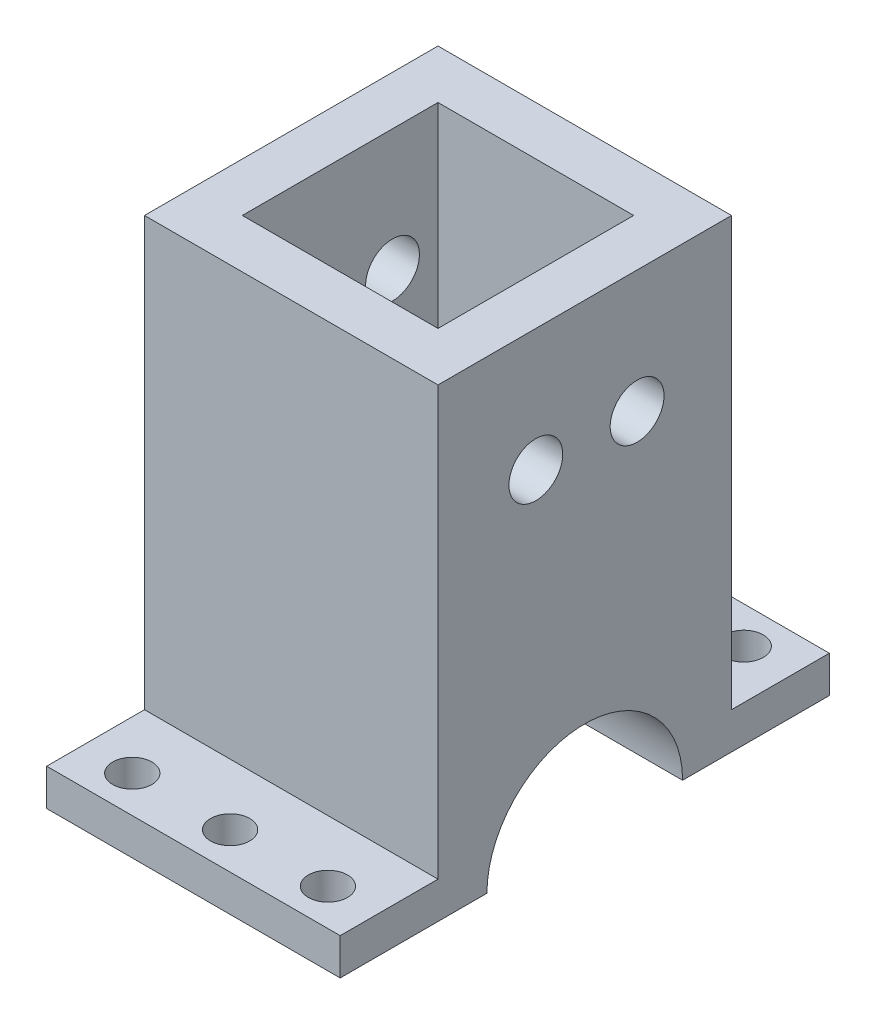
ISO-10303-21;
HEADER;
FILE_DESCRIPTION(('STEP AP214'),'2;1');
FILE_NAME('part.step','',(''),(''),'','','');
FILE_SCHEMA(('AUTOMOTIVE_DESIGN { 1 0 10303 214 1 1 1 1 }'));
ENDSEC;
DATA;
#1=APPLICATION_CONTEXT('core data for automotive mechanical design processes');
#2=APPLICATION_PROTOCOL_DEFINITION('international standard','automotive_design',2000,#1);
#3=PRODUCT_CONTEXT('',#1,'mechanical');
#4=PRODUCT('Part','Part','',(#3));
#5=PRODUCT_RELATED_PRODUCT_CATEGORY('part','',(#4));
#6=PRODUCT_DEFINITION_FORMATION('','',#4);
#7=PRODUCT_DEFINITION_CONTEXT('part definition',#1,'design');
#8=PRODUCT_DEFINITION('design','',#6,#7);
#9=PRODUCT_DEFINITION_SHAPE('','',#8);
#10=(LENGTH_UNIT() NAMED_UNIT(*) SI_UNIT(.MILLI.,.METRE.));
#11=(NAMED_UNIT(*) PLANE_ANGLE_UNIT() SI_UNIT($,.RADIAN.));
#12=(NAMED_UNIT(*) SI_UNIT($,.STERADIAN.) SOLID_ANGLE_UNIT());
#13=UNCERTAINTY_MEASURE_WITH_UNIT(LENGTH_MEASURE(1.E-05),#10,'distance_accuracy_value','');
#14=(GEOMETRIC_REPRESENTATION_CONTEXT(3) GLOBAL_UNCERTAINTY_ASSIGNED_CONTEXT((#13)) GLOBAL_UNIT_ASSIGNED_CONTEXT((#10,
#11,#12)) REPRESENTATION_CONTEXT('',''));
#15=CARTESIAN_POINT('',(0.,0.,0.));
#16=DIRECTION('',(0.,0.,1.));
#17=DIRECTION('',(1.,0.,0.));
#18=AXIS2_PLACEMENT_3D('',#15,#16,#17);
#19=CARTESIAN_POINT('',(-4.,-20.,0.));
#20=DIRECTION('',(-1.,0.,0.));
#21=DIRECTION('',(0.,0.,1.));
#22=AXIS2_PLACEMENT_3D('',#19,#20,#21);
#23=PLANE('',#22);
#24=CARTESIAN_POINT('',(-4.,-10.,-12.2801394976566));
#25=DIRECTION('',(-1.,0.,0.));
#26=DIRECTION('',(0.,0.,1.));
#27=AXIS2_PLACEMENT_3D('',#24,#25,#26);
#28=CIRCLE('',#27,2.2);
#29=CARTESIAN_POINT('',(-4.,-10.,-10.0801394976566));
#30=VERTEX_POINT('',#29);
#31=EDGE_CURVE('E349',#30,#30,#28,.T.);
#32=ORIENTED_EDGE('',*,*,#31,.F.);
#33=EDGE_LOOP('',(#32));
#34=FACE_BOUND('',#33,.T.);
#35=CARTESIAN_POINT('',(-4.,-10.,-4.));
#36=DIRECTION('',(-1.,0.,0.));
#37=DIRECTION('',(0.,0.,1.));
#38=AXIS2_PLACEMENT_3D('',#35,#36,#37);
#39=CIRCLE('',#38,2.2);
#40=CARTESIAN_POINT('',(-4.,-10.,-1.8));
#41=VERTEX_POINT('',#40);
#42=EDGE_CURVE('E335',#41,#41,#39,.T.);
#43=ORIENTED_EDGE('',*,*,#42,.F.);
#44=EDGE_LOOP('',(#43));
#45=FACE_BOUND('',#44,.T.);
#46=DIRECTION('',(0.,0.,1.));
#47=VECTOR('',#46,1.);
#48=CARTESIAN_POINT('',(-4.,0.,0.));
#49=LINE('',#48,#47);
#50=CARTESIAN_POINT('',(-4.,0.,-20.));
#51=VERTEX_POINT('',#50);
#52=CARTESIAN_POINT('',(-4.,0.,4.));
#53=VERTEX_POINT('',#52);
#54=EDGE_CURVE('E266',#51,#53,#49,.T.);
#55=ORIENTED_EDGE('',*,*,#54,.F.);
#56=DIRECTION('',(0.,1.,0.));
#57=VECTOR('',#56,1.);
#58=CARTESIAN_POINT('',(-4.,-20.,-20.));
#59=LINE('',#58,#57);
#60=CARTESIAN_POINT('',(-4.,-35.,-20.));
#61=VERTEX_POINT('',#60);
#62=EDGE_CURVE('E11',#61,#51,#59,.T.);
#63=ORIENTED_EDGE('',*,*,#62,.F.);
#64=DIRECTION('',(0.,0.,1.));
#65=VECTOR('',#64,1.);
#66=CARTESIAN_POINT('',(-4.,-35.,0.));
#67=LINE('',#66,#65);
#68=CARTESIAN_POINT('',(-4.,-35.,-28.));
#69=VERTEX_POINT('',#68);
#70=EDGE_CURVE('E193',#69,#61,#67,.T.);
#71=ORIENTED_EDGE('',*,*,#70,.F.);
#72=DIRECTION('',(0.,1.,0.));
#73=VECTOR('',#72,1.);
#74=CARTESIAN_POINT('',(-4.,0.,-28.));
#75=LINE('',#74,#73);
#76=CARTESIAN_POINT('',(-4.,-38.,-28.));
#77=VERTEX_POINT('',#76);
#78=EDGE_CURVE('E173',#77,#69,#75,.T.);
#79=ORIENTED_EDGE('',*,*,#78,.F.);
#80=DIRECTION('',(0.,0.,1.));
#81=VECTOR('',#80,1.);
#82=CARTESIAN_POINT('',(-4.,-38.,0.));
#83=LINE('',#82,#81);
#84=CARTESIAN_POINT('',(-4.,-38.,-16.));
#85=VERTEX_POINT('',#84);
#86=EDGE_CURVE('E169',#77,#85,#83,.T.);
#87=ORIENTED_EDGE('',*,*,#86,.T.);
#88=CARTESIAN_POINT('',(-4.,-38.,-8.));
#89=DIRECTION('',(-1.,0.,0.));
#90=DIRECTION('',(0.,0.,1.));
#91=AXIS2_PLACEMENT_3D('',#88,#89,#90);
#92=CIRCLE('',#91,8.);
#93=CARTESIAN_POINT('',(-4.,-38.,0.));
#94=VERTEX_POINT('',#93);
#95=EDGE_CURVE('E151',#94,#85,#92,.T.);
#96=ORIENTED_EDGE('',*,*,#95,.F.);
#97=DIRECTION('',(0.,0.,1.));
#98=VECTOR('',#97,1.);
#99=CARTESIAN_POINT('',(-4.,-38.,-1.31838984174237E-13));
#100=LINE('',#99,#98);
#101=CARTESIAN_POINT('',(-4.,-38.,12.));
#102=VERTEX_POINT('',#101);
#103=EDGE_CURVE('E163',#94,#102,#100,.T.);
#104=ORIENTED_EDGE('',*,*,#103,.T.);
#105=DIRECTION('',(0.,1.,0.));
#106=VECTOR('',#105,1.);
#107=CARTESIAN_POINT('',(-4.,0.,12.));
#108=LINE('',#107,#106);
#109=CARTESIAN_POINT('',(-4.,-35.,12.));
#110=VERTEX_POINT('',#109);
#111=EDGE_CURVE('E179',#102,#110,#108,.T.);
#112=ORIENTED_EDGE('',*,*,#111,.T.);
#113=DIRECTION('',(0.,0.,-1.));
#114=VECTOR('',#113,1.);
#115=CARTESIAN_POINT('',(-4.,-35.,0.));
#116=LINE('',#115,#114);
#117=CARTESIAN_POINT('',(-4.,-35.,4.));
#118=VERTEX_POINT('',#117);
#119=EDGE_CURVE('E164',#110,#118,#116,.T.);
#120=ORIENTED_EDGE('',*,*,#119,.T.);
#121=DIRECTION('',(0.,1.,0.));
#122=VECTOR('',#121,1.);
#123=CARTESIAN_POINT('',(-4.,-20.,4.));
#124=LINE('',#123,#122);
#125=EDGE_CURVE('E285',#118,#53,#124,.T.);
#126=ORIENTED_EDGE('',*,*,#125,.T.);
#127=EDGE_LOOP('',(#55,#63,#71,#79,#87,#96,#104,#112,#120,#126));
#128=FACE_BOUND('',#127,.T.);
#129=ADVANCED_FACE('F40',(#34,#45,#128),#23,.T.);
#130=CARTESIAN_POINT('',(0.,-20.,-20.));
#131=DIRECTION('',(0.,0.,1.));
#132=DIRECTION('',(1.,0.,0.));
#133=AXIS2_PLACEMENT_3D('',#130,#131,#132);
#134=PLANE('',#133);
#135=DIRECTION('',(1.,0.,0.));
#136=VECTOR('',#135,1.);
#137=CARTESIAN_POINT('',(0.,0.,-20.));
#138=LINE('',#137,#136);
#139=CARTESIAN_POINT('',(20.,0.,-20.));
#140=VERTEX_POINT('',#139);
#141=EDGE_CURVE('E242',#51,#140,#138,.T.);
#142=ORIENTED_EDGE('',*,*,#141,.T.);
#143=DIRECTION('',(0.,1.,0.));
#144=VECTOR('',#143,1.);
#145=CARTESIAN_POINT('',(20.,-20.,-20.));
#146=LINE('',#145,#144);
#147=CARTESIAN_POINT('',(20.,-35.,-20.));
#148=VERTEX_POINT('',#147);
#149=EDGE_CURVE('E51',#148,#140,#146,.T.);
#150=ORIENTED_EDGE('',*,*,#149,.F.);
#151=DIRECTION('',(-1.,0.,0.));
#152=VECTOR('',#151,1.);
#153=CARTESIAN_POINT('',(20.,-35.,-20.));
#154=LINE('',#153,#152);
#155=EDGE_CURVE('E202',#148,#61,#154,.T.);
#156=ORIENTED_EDGE('',*,*,#155,.T.);
#157=ORIENTED_EDGE('',*,*,#62,.T.);
#158=EDGE_LOOP('',(#142,#150,#156,#157));
#159=FACE_BOUND('',#158,.T.);
#160=ADVANCED_FACE('F404',(#159),#134,.F.);
#161=CARTESIAN_POINT('',(20.,-20.,0.));
#162=DIRECTION('',(1.,0.,0.));
#163=DIRECTION('',(0.,0.,-1.));
#164=AXIS2_PLACEMENT_3D('',#161,#162,#163);
#165=PLANE('',#164);
#166=CARTESIAN_POINT('',(20.,-10.,-12.2801394976566));
#167=DIRECTION('',(1.,0.,0.));
#168=DIRECTION('',(0.,0.,-1.));
#169=AXIS2_PLACEMENT_3D('',#166,#167,#168);
#170=CIRCLE('',#169,2.2);
#171=CARTESIAN_POINT('',(20.,-10.,-14.4801394976566));
#172=VERTEX_POINT('',#171);
#173=EDGE_CURVE('E345',#172,#172,#170,.T.);
#174=ORIENTED_EDGE('',*,*,#173,.F.);
#175=EDGE_LOOP('',(#174));
#176=FACE_BOUND('',#175,.T.);
#177=CARTESIAN_POINT('',(20.,-10.,-4.));
#178=DIRECTION('',(1.,0.,0.));
#179=DIRECTION('',(0.,0.,-1.));
#180=AXIS2_PLACEMENT_3D('',#177,#178,#179);
#181=CIRCLE('',#180,2.2);
#182=CARTESIAN_POINT('',(20.,-10.,-6.2));
#183=VERTEX_POINT('',#182);
#184=EDGE_CURVE('E329',#183,#183,#181,.T.);
#185=ORIENTED_EDGE('',*,*,#184,.F.);
#186=EDGE_LOOP('',(#185));
#187=FACE_BOUND('',#186,.T.);
#188=DIRECTION('',(0.,0.,-1.));
#189=VECTOR('',#188,1.);
#190=CARTESIAN_POINT('',(20.,0.,0.));
#191=LINE('',#190,#189);
#192=CARTESIAN_POINT('',(20.,0.,4.));
#193=VERTEX_POINT('',#192);
#194=EDGE_CURVE('E274',#193,#140,#191,.T.);
#195=ORIENTED_EDGE('',*,*,#194,.F.);
#196=DIRECTION('',(0.,1.,0.));
#197=VECTOR('',#196,1.);
#198=CARTESIAN_POINT('',(20.,-20.,4.));
#199=LINE('',#198,#197);
#200=CARTESIAN_POINT('',(20.,-35.,4.));
#201=VERTEX_POINT('',#200);
#202=EDGE_CURVE('E282',#201,#193,#199,.T.);
#203=ORIENTED_EDGE('',*,*,#202,.F.);
#204=DIRECTION('',(0.,0.,-1.));
#205=VECTOR('',#204,1.);
#206=CARTESIAN_POINT('',(20.,-35.,0.));
#207=LINE('',#206,#205);
#208=CARTESIAN_POINT('',(20.,-35.,12.));
#209=VERTEX_POINT('',#208);
#210=EDGE_CURVE('E208',#209,#201,#207,.T.);
#211=ORIENTED_EDGE('',*,*,#210,.F.);
#212=DIRECTION('',(0.,1.,0.));
#213=VECTOR('',#212,1.);
#214=CARTESIAN_POINT('',(20.,0.,12.));
#215=LINE('',#214,#213);
#216=CARTESIAN_POINT('',(20.,-38.,12.));
#217=VERTEX_POINT('',#216);
#218=EDGE_CURVE('E204',#217,#209,#215,.T.);
#219=ORIENTED_EDGE('',*,*,#218,.F.);
#220=DIRECTION('',(0.,0.,1.));
#221=VECTOR('',#220,1.);
#222=CARTESIAN_POINT('',(20.,-38.,-1.31838984174237E-13));
#223=LINE('',#222,#221);
#224=CARTESIAN_POINT('',(20.,-38.,0.));
#225=VERTEX_POINT('',#224);
#226=EDGE_CURVE('E215',#225,#217,#223,.T.);
#227=ORIENTED_EDGE('',*,*,#226,.F.);
#228=CARTESIAN_POINT('',(20.,-38.,-8.));
#229=DIRECTION('',(-1.,0.,0.));
#230=DIRECTION('',(0.,0.,1.));
#231=AXIS2_PLACEMENT_3D('',#228,#229,#230);
#232=CIRCLE('',#231,8.);
#233=CARTESIAN_POINT('',(20.,-38.,-16.));
#234=VERTEX_POINT('',#233);
#235=EDGE_CURVE('E212',#225,#234,#232,.T.);
#236=ORIENTED_EDGE('',*,*,#235,.T.);
#237=DIRECTION('',(0.,0.,1.));
#238=VECTOR('',#237,1.);
#239=CARTESIAN_POINT('',(20.,-38.,0.));
#240=LINE('',#239,#238);
#241=CARTESIAN_POINT('',(20.,-38.,-28.));
#242=VERTEX_POINT('',#241);
#243=EDGE_CURVE('E171',#242,#234,#240,.T.);
#244=ORIENTED_EDGE('',*,*,#243,.F.);
#245=DIRECTION('',(0.,1.,0.));
#246=VECTOR('',#245,1.);
#247=CARTESIAN_POINT('',(20.,0.,-28.));
#248=LINE('',#247,#246);
#249=CARTESIAN_POINT('',(20.,-35.,-28.));
#250=VERTEX_POINT('',#249);
#251=EDGE_CURVE('E186',#242,#250,#248,.T.);
#252=ORIENTED_EDGE('',*,*,#251,.T.);
#253=DIRECTION('',(0.,0.,1.));
#254=VECTOR('',#253,1.);
#255=CARTESIAN_POINT('',(20.,-35.,0.));
#256=LINE('',#255,#254);
#257=EDGE_CURVE('E180',#250,#148,#256,.T.);
#258=ORIENTED_EDGE('',*,*,#257,.T.);
#259=ORIENTED_EDGE('',*,*,#149,.T.);
#260=EDGE_LOOP('',(#195,#203,#211,#219,#227,#236,#244,#252,#258,#259));
#261=FACE_BOUND('',#260,.T.);
#262=ADVANCED_FACE('F386',(#176,#187,#261),#165,.T.);
#263=CARTESIAN_POINT('',(16.,-20.,0.));
#264=DIRECTION('',(1.,0.,0.));
#265=DIRECTION('',(0.,0.,-1.));
#266=AXIS2_PLACEMENT_3D('',#263,#264,#265);
#267=PLANE('',#266);
#268=CARTESIAN_POINT('',(16.,-10.,-12.2801394976566));
#269=DIRECTION('',(1.,0.,0.));
#270=DIRECTION('',(0.,0.,-1.));
#271=AXIS2_PLACEMENT_3D('',#268,#269,#270);
#272=CIRCLE('',#271,2.2);
#273=CARTESIAN_POINT('',(16.,-10.,-14.4801394976566));
#274=VERTEX_POINT('',#273);
#275=EDGE_CURVE('E341',#274,#274,#272,.T.);
#276=ORIENTED_EDGE('',*,*,#275,.T.);
#277=EDGE_LOOP('',(#276));
#278=FACE_BOUND('',#277,.T.);
#279=CARTESIAN_POINT('',(16.,-10.,-4.));
#280=DIRECTION('',(1.,0.,0.));
#281=DIRECTION('',(0.,0.,-1.));
#282=AXIS2_PLACEMENT_3D('',#279,#280,#281);
#283=CIRCLE('',#282,2.2);
#284=CARTESIAN_POINT('',(16.,-10.,-6.2));
#285=VERTEX_POINT('',#284);
#286=EDGE_CURVE('E324',#285,#285,#283,.T.);
#287=ORIENTED_EDGE('',*,*,#286,.T.);
#288=EDGE_LOOP('',(#287));
#289=FACE_BOUND('',#288,.T.);
#290=DIRECTION('',(0.,0.,-1.));
#291=VECTOR('',#290,1.);
#292=CARTESIAN_POINT('',(16.,0.,0.));
#293=LINE('',#292,#291);
#294=CARTESIAN_POINT('',(16.,0.,0.));
#295=VERTEX_POINT('',#294);
#296=CARTESIAN_POINT('',(16.,0.,-16.));
#297=VERTEX_POINT('',#296);
#298=EDGE_CURVE('E228',#295,#297,#293,.T.);
#299=ORIENTED_EDGE('',*,*,#298,.T.);
#300=DIRECTION('',(0.,1.,0.));
#301=VECTOR('',#300,1.);
#302=CARTESIAN_POINT('',(16.,-20.,-16.));
#303=LINE('',#302,#301);
#304=CARTESIAN_POINT('',(16.,-20.,-16.));
#305=VERTEX_POINT('',#304);
#306=EDGE_CURVE('E60',#305,#297,#303,.T.);
#307=ORIENTED_EDGE('',*,*,#306,.F.);
#308=DIRECTION('',(0.,0.,-1.));
#309=VECTOR('',#308,1.);
#310=CARTESIAN_POINT('',(16.,-20.,0.));
#311=LINE('',#310,#309);
#312=CARTESIAN_POINT('',(16.,-20.,0.));
#313=VERTEX_POINT('',#312);
#314=EDGE_CURVE('E237',#313,#305,#311,.T.);
#315=ORIENTED_EDGE('',*,*,#314,.F.);
#316=DIRECTION('',(0.,1.,0.));
#317=VECTOR('',#316,1.);
#318=CARTESIAN_POINT('',(16.,-20.,0.));
#319=LINE('',#318,#317);
#320=EDGE_CURVE('E252',#313,#295,#319,.T.);
#321=ORIENTED_EDGE('',*,*,#320,.T.);
#322=EDGE_LOOP('',(#299,#307,#315,#321));
#323=FACE_BOUND('',#322,.T.);
#324=ADVANCED_FACE('F42',(#278,#289,#323),#267,.F.);
#325=CARTESIAN_POINT('',(0.,-20.,-16.));
#326=DIRECTION('',(0.,0.,1.));
#327=DIRECTION('',(1.,0.,0.));
#328=AXIS2_PLACEMENT_3D('',#325,#326,#327);
#329=PLANE('',#328);
#330=DIRECTION('',(1.,0.,0.));
#331=VECTOR('',#330,1.);
#332=CARTESIAN_POINT('',(0.,0.,-16.));
#333=LINE('',#332,#331);
#334=CARTESIAN_POINT('',(0.,0.,-16.));
#335=VERTEX_POINT('',#334);
#336=EDGE_CURVE('E262',#335,#297,#333,.T.);
#337=ORIENTED_EDGE('',*,*,#336,.F.);
#338=DIRECTION('',(0.,1.,0.));
#339=VECTOR('',#338,1.);
#340=CARTESIAN_POINT('',(0.,-20.,-16.));
#341=LINE('',#340,#339);
#342=CARTESIAN_POINT('',(0.,-20.,-16.));
#343=VERTEX_POINT('',#342);
#344=EDGE_CURVE('E290',#343,#335,#341,.T.);
#345=ORIENTED_EDGE('',*,*,#344,.F.);
#346=DIRECTION('',(1.,0.,0.));
#347=VECTOR('',#346,1.);
#348=CARTESIAN_POINT('',(0.,-20.,-16.));
#349=LINE('',#348,#347);
#350=EDGE_CURVE('E249',#343,#305,#349,.T.);
#351=ORIENTED_EDGE('',*,*,#350,.T.);
#352=ORIENTED_EDGE('',*,*,#306,.T.);
#353=EDGE_LOOP('',(#337,#345,#351,#352));
#354=FACE_BOUND('',#353,.T.);
#355=ADVANCED_FACE('F436',(#354),#329,.T.);
#356=CARTESIAN_POINT('',(0.,-20.,0.));
#357=DIRECTION('',(1.,0.,0.));
#358=DIRECTION('',(0.,0.,-1.));
#359=AXIS2_PLACEMENT_3D('',#356,#357,#358);
#360=PLANE('',#359);
#361=CARTESIAN_POINT('',(0.,-10.,-12.2801394976566));
#362=DIRECTION('',(1.,0.,0.));
#363=DIRECTION('',(0.,0.,-1.));
#364=AXIS2_PLACEMENT_3D('',#361,#362,#363);
#365=CIRCLE('',#364,2.2);
#366=CARTESIAN_POINT('',(0.,-10.,-14.4801394976566));
#367=VERTEX_POINT('',#366);
#368=EDGE_CURVE('E44',#367,#367,#365,.T.);
#369=ORIENTED_EDGE('',*,*,#368,.F.);
#370=EDGE_LOOP('',(#369));
#371=FACE_BOUND('',#370,.T.);
#372=CARTESIAN_POINT('',(0.,-10.,-4.));
#373=DIRECTION('',(1.,0.,0.));
#374=DIRECTION('',(0.,0.,-1.));
#375=AXIS2_PLACEMENT_3D('',#372,#373,#374);
#376=CIRCLE('',#375,2.2);
#377=CARTESIAN_POINT('',(0.,-10.,-6.2));
#378=VERTEX_POINT('',#377);
#379=EDGE_CURVE('E321',#378,#378,#376,.T.);
#380=ORIENTED_EDGE('',*,*,#379,.F.);
#381=EDGE_LOOP('',(#380));
#382=FACE_BOUND('',#381,.T.);
#383=DIRECTION('',(0.,0.,-1.));
#384=VECTOR('',#383,1.);
#385=CARTESIAN_POINT('',(0.,0.,0.));
#386=LINE('',#385,#384);
#387=CARTESIAN_POINT('',(0.,0.,0.));
#388=VERTEX_POINT('',#387);
#389=EDGE_CURVE('E258',#388,#335,#386,.T.);
#390=ORIENTED_EDGE('',*,*,#389,.F.);
#391=DIRECTION('',(0.,1.,0.));
#392=VECTOR('',#391,1.);
#393=CARTESIAN_POINT('',(0.,-20.,0.));
#394=LINE('',#393,#392);
#395=CARTESIAN_POINT('',(0.,-20.,0.));
#396=VERTEX_POINT('',#395);
#397=EDGE_CURVE('E99',#396,#388,#394,.T.);
#398=ORIENTED_EDGE('',*,*,#397,.F.);
#399=DIRECTION('',(0.,0.,-1.));
#400=VECTOR('',#399,1.);
#401=CARTESIAN_POINT('',(0.,-20.,0.));
#402=LINE('',#401,#400);
#403=EDGE_CURVE('E246',#396,#343,#402,.T.);
#404=ORIENTED_EDGE('',*,*,#403,.T.);
#405=ORIENTED_EDGE('',*,*,#344,.T.);
#406=EDGE_LOOP('',(#390,#398,#404,#405));
#407=FACE_BOUND('',#406,.T.);
#408=ADVANCED_FACE('F439',(#371,#382,#407),#360,.T.);
#409=CARTESIAN_POINT('',(0.,-20.,0.));
#410=DIRECTION('',(0.,0.,1.));
#411=DIRECTION('',(1.,0.,0.));
#412=AXIS2_PLACEMENT_3D('',#409,#410,#411);
#413=PLANE('',#412);
#414=DIRECTION('',(1.,0.,0.));
#415=VECTOR('',#414,1.);
#416=CARTESIAN_POINT('',(0.,0.,0.));
#417=LINE('',#416,#415);
#418=EDGE_CURVE('E255',#388,#295,#417,.T.);
#419=ORIENTED_EDGE('',*,*,#418,.T.);
#420=ORIENTED_EDGE('',*,*,#320,.F.);
#421=DIRECTION('',(1.,0.,0.));
#422=VECTOR('',#421,1.);
#423=CARTESIAN_POINT('',(0.,-20.,0.));
#424=LINE('',#423,#422);
#425=EDGE_CURVE('E241',#396,#313,#424,.T.);
#426=ORIENTED_EDGE('',*,*,#425,.F.);
#427=ORIENTED_EDGE('',*,*,#397,.T.);
#428=EDGE_LOOP('',(#419,#420,#426,#427));
#429=FACE_BOUND('',#428,.T.);
#430=ADVANCED_FACE('F442',(#429),#413,.F.);
#431=CARTESIAN_POINT('',(0.,-20.,4.));
#432=DIRECTION('',(0.,0.,1.));
#433=DIRECTION('',(1.,0.,0.));
#434=AXIS2_PLACEMENT_3D('',#431,#432,#433);
#435=PLANE('',#434);
#436=DIRECTION('',(1.,0.,0.));
#437=VECTOR('',#436,1.);
#438=CARTESIAN_POINT('',(0.,0.,4.));
#439=LINE('',#438,#437);
#440=EDGE_CURVE('E270',#53,#193,#439,.T.);
#441=ORIENTED_EDGE('',*,*,#440,.F.);
#442=ORIENTED_EDGE('',*,*,#125,.F.);
#443=DIRECTION('',(-1.,0.,0.));
#444=VECTOR('',#443,1.);
#445=CARTESIAN_POINT('',(20.,-35.,4.));
#446=LINE('',#445,#444);
#447=EDGE_CURVE('E231',#201,#118,#446,.T.);
#448=ORIENTED_EDGE('',*,*,#447,.F.);
#449=ORIENTED_EDGE('',*,*,#202,.T.);
#450=EDGE_LOOP('',(#441,#442,#448,#449));
#451=FACE_BOUND('',#450,.T.);
#452=ADVANCED_FACE('F401',(#451),#435,.T.);
#453=CARTESIAN_POINT('',(0.,0.,0.));
#454=DIRECTION('',(0.,1.,0.));
#455=DIRECTION('',(0.,0.,1.));
#456=AXIS2_PLACEMENT_3D('',#453,#454,#455);
#457=PLANE('',#456);
#458=ORIENTED_EDGE('',*,*,#298,.F.);
#459=ORIENTED_EDGE('',*,*,#418,.F.);
#460=ORIENTED_EDGE('',*,*,#389,.T.);
#461=ORIENTED_EDGE('',*,*,#336,.T.);
#462=EDGE_LOOP('',(#458,#459,#460,#461));
#463=FACE_BOUND('',#462,.T.);
#464=ORIENTED_EDGE('',*,*,#54,.T.);
#465=ORIENTED_EDGE('',*,*,#440,.T.);
#466=ORIENTED_EDGE('',*,*,#194,.T.);
#467=ORIENTED_EDGE('',*,*,#141,.F.);
#468=EDGE_LOOP('',(#464,#465,#466,#467));
#469=FACE_BOUND('',#468,.T.);
#470=ADVANCED_FACE('F403',(#463,#469),#457,.T.);
#471=CARTESIAN_POINT('',(0.,-20.,0.));
#472=DIRECTION('',(0.,1.,0.));
#473=DIRECTION('',(0.,0.,1.));
#474=AXIS2_PLACEMENT_3D('',#471,#472,#473);
#475=PLANE('',#474);
#476=ORIENTED_EDGE('',*,*,#425,.T.);
#477=ORIENTED_EDGE('',*,*,#314,.T.);
#478=ORIENTED_EDGE('',*,*,#350,.F.);
#479=ORIENTED_EDGE('',*,*,#403,.F.);
#480=EDGE_LOOP('',(#476,#477,#478,#479));
#481=FACE_BOUND('',#480,.T.);
#482=ADVANCED_FACE('F458',(#481),#475,.T.);
#483=CARTESIAN_POINT('',(20.,0.,12.));
#484=DIRECTION('',(0.,0.,1.));
#485=DIRECTION('',(1.,0.,0.));
#486=AXIS2_PLACEMENT_3D('',#483,#484,#485);
#487=PLANE('',#486);
#488=ORIENTED_EDGE('',*,*,#111,.F.);
#489=DIRECTION('',(-1.,0.,0.));
#490=VECTOR('',#489,1.);
#491=CARTESIAN_POINT('',(20.,-38.,12.));
#492=LINE('',#491,#490);
#493=EDGE_CURVE('E225',#217,#102,#492,.T.);
#494=ORIENTED_EDGE('',*,*,#493,.F.);
#495=ORIENTED_EDGE('',*,*,#218,.T.);
#496=DIRECTION('',(-1.,0.,0.));
#497=VECTOR('',#496,1.);
#498=CARTESIAN_POINT('',(20.,-35.,12.));
#499=LINE('',#498,#497);
#500=EDGE_CURVE('E218',#209,#110,#499,.T.);
#501=ORIENTED_EDGE('',*,*,#500,.T.);
#502=EDGE_LOOP('',(#488,#494,#495,#501));
#503=FACE_BOUND('',#502,.T.);
#504=ADVANCED_FACE('F395',(#503),#487,.T.);
#505=CARTESIAN_POINT('',(20.,-38.,-1.31838984174237E-13));
#506=DIRECTION('',(0.,-1.,0.));
#507=DIRECTION('',(0.,0.,-1.));
#508=AXIS2_PLACEMENT_3D('',#505,#506,#507);
#509=PLANE('',#508);
#510=CARTESIAN_POINT('',(16.,-38.,9.00000000000006));
#511=DIRECTION('',(0.,-1.,0.));
#512=DIRECTION('',(0.,0.,-1.));
#513=AXIS2_PLACEMENT_3D('',#510,#511,#512);
#514=CIRCLE('',#513,1.6);
#515=CARTESIAN_POINT('',(16.,-38.,7.40000000000006));
#516=VERTEX_POINT('',#515);
#517=EDGE_CURVE('E358',#516,#516,#514,.T.);
#518=ORIENTED_EDGE('',*,*,#517,.F.);
#519=EDGE_LOOP('',(#518));
#520=FACE_BOUND('',#519,.T.);
#521=CARTESIAN_POINT('',(0.,-38.,9.00000000000006));
#522=DIRECTION('',(0.,-1.,0.));
#523=DIRECTION('',(0.,0.,1.));
#524=AXIS2_PLACEMENT_3D('',#521,#522,#523);
#525=CIRCLE('',#524,1.6);
#526=CARTESIAN_POINT('',(0.,-38.,10.6000000000001));
#527=VERTEX_POINT('',#526);
#528=EDGE_CURVE('E362',#527,#527,#525,.T.);
#529=ORIENTED_EDGE('',*,*,#528,.F.);
#530=EDGE_LOOP('',(#529));
#531=FACE_BOUND('',#530,.T.);
#532=CARTESIAN_POINT('',(8.,-38.,9.));
#533=DIRECTION('',(0.,-1.,0.));
#534=DIRECTION('',(0.,0.,-1.));
#535=AXIS2_PLACEMENT_3D('',#532,#533,#534);
#536=CIRCLE('',#535,1.6);
#537=CARTESIAN_POINT('',(8.,-38.,7.4));
#538=VERTEX_POINT('',#537);
#539=EDGE_CURVE('E303',#538,#538,#536,.T.);
#540=ORIENTED_EDGE('',*,*,#539,.F.);
#541=EDGE_LOOP('',(#540));
#542=FACE_BOUND('',#541,.T.);
#543=ORIENTED_EDGE('',*,*,#103,.F.);
#544=DIRECTION('',(-1.,0.,0.));
#545=VECTOR('',#544,1.);
#546=CARTESIAN_POINT('',(20.,-38.,0.));
#547=LINE('',#546,#545);
#548=EDGE_CURVE('E157',#225,#94,#547,.T.);
#549=ORIENTED_EDGE('',*,*,#548,.F.);
#550=ORIENTED_EDGE('',*,*,#226,.T.);
#551=ORIENTED_EDGE('',*,*,#493,.T.);
#552=EDGE_LOOP('',(#543,#549,#550,#551));
#553=FACE_BOUND('',#552,.T.);
#554=ADVANCED_FACE('F391',(#520,#531,#542,#553),#509,.T.);
#555=CARTESIAN_POINT('',(20.,-38.,-8.));
#556=DIRECTION('',(-1.,0.,0.));
#557=DIRECTION('',(0.,0.,1.));
#558=AXIS2_PLACEMENT_3D('',#555,#556,#557);
#559=CYLINDRICAL_SURFACE('',#558,8.);
#560=ORIENTED_EDGE('',*,*,#95,.T.);
#561=DIRECTION('',(-1.,0.,0.));
#562=VECTOR('',#561,1.);
#563=CARTESIAN_POINT('',(20.,-38.,-16.));
#564=LINE('',#563,#562);
#565=EDGE_CURVE('E155',#234,#85,#564,.T.);
#566=ORIENTED_EDGE('',*,*,#565,.F.);
#567=ORIENTED_EDGE('',*,*,#235,.F.);
#568=ORIENTED_EDGE('',*,*,#548,.T.);
#569=EDGE_LOOP('',(#560,#566,#567,#568));
#570=FACE_BOUND('',#569,.T.);
#571=ADVANCED_FACE('F153',(#570),#559,.F.);
#572=CARTESIAN_POINT('',(20.,-35.,0.));
#573=DIRECTION('',(0.,1.,0.));
#574=DIRECTION('',(0.,0.,1.));
#575=AXIS2_PLACEMENT_3D('',#572,#573,#574);
#576=PLANE('',#575);
#577=CARTESIAN_POINT('',(16.,-35.,9.00000000000007));
#578=DIRECTION('',(0.,1.,0.));
#579=DIRECTION('',(0.,0.,1.));
#580=AXIS2_PLACEMENT_3D('',#577,#578,#579);
#581=CIRCLE('',#580,1.6);
#582=CARTESIAN_POINT('',(16.,-35.,10.6000000000001));
#583=VERTEX_POINT('',#582);
#584=EDGE_CURVE('E200',#583,#583,#581,.T.);
#585=ORIENTED_EDGE('',*,*,#584,.F.);
#586=EDGE_LOOP('',(#585));
#587=FACE_BOUND('',#586,.T.);
#588=CARTESIAN_POINT('',(0.,-35.,9.00000000000007));
#589=DIRECTION('',(0.,1.,0.));
#590=DIRECTION('',(0.,0.,1.));
#591=AXIS2_PLACEMENT_3D('',#588,#589,#590);
#592=CIRCLE('',#591,1.6);
#593=CARTESIAN_POINT('',(0.,-35.,10.6000000000001));
#594=VERTEX_POINT('',#593);
#595=EDGE_CURVE('E315',#594,#594,#592,.T.);
#596=ORIENTED_EDGE('',*,*,#595,.F.);
#597=EDGE_LOOP('',(#596));
#598=FACE_BOUND('',#597,.T.);
#599=CARTESIAN_POINT('',(8.,-35.,9.00000000000001));
#600=DIRECTION('',(0.,1.,0.));
#601=DIRECTION('',(0.,0.,1.));
#602=AXIS2_PLACEMENT_3D('',#599,#600,#601);
#603=CIRCLE('',#602,1.6);
#604=CARTESIAN_POINT('',(8.,-35.,10.6));
#605=VERTEX_POINT('',#604);
#606=EDGE_CURVE('E311',#605,#605,#603,.T.);
#607=ORIENTED_EDGE('',*,*,#606,.F.);
#608=EDGE_LOOP('',(#607));
#609=FACE_BOUND('',#608,.T.);
#610=ORIENTED_EDGE('',*,*,#119,.F.);
#611=ORIENTED_EDGE('',*,*,#500,.F.);
#612=ORIENTED_EDGE('',*,*,#210,.T.);
#613=ORIENTED_EDGE('',*,*,#447,.T.);
#614=EDGE_LOOP('',(#610,#611,#612,#613));
#615=FACE_BOUND('',#614,.T.);
#616=ADVANCED_FACE('F397',(#587,#598,#609,#615),#576,.T.);
#617=CARTESIAN_POINT('',(20.,-38.,0.));
#618=DIRECTION('',(0.,-1.,0.));
#619=DIRECTION('',(0.,0.,-1.));
#620=AXIS2_PLACEMENT_3D('',#617,#618,#619);
#621=PLANE('',#620);
#622=CARTESIAN_POINT('',(0.,-37.9999999999999,-25.0000000000001));
#623=DIRECTION('',(0.,-1.,0.));
#624=DIRECTION('',(0.,0.,-1.));
#625=AXIS2_PLACEMENT_3D('',#622,#623,#624);
#626=CIRCLE('',#625,1.6);
#627=CARTESIAN_POINT('',(0.,-37.9999999999999,-26.6000000000001));
#628=VERTEX_POINT('',#627);
#629=EDGE_CURVE('E366',#628,#628,#626,.T.);
#630=ORIENTED_EDGE('',*,*,#629,.F.);
#631=EDGE_LOOP('',(#630));
#632=FACE_BOUND('',#631,.T.);
#633=CARTESIAN_POINT('',(8.,-37.9999999999999,-25.));
#634=DIRECTION('',(0.,-1.,0.));
#635=DIRECTION('',(0.,0.,1.));
#636=AXIS2_PLACEMENT_3D('',#633,#634,#635);
#637=CIRCLE('',#636,1.6);
#638=CARTESIAN_POINT('',(8.,-37.9999999999999,-23.4));
#639=VERTEX_POINT('',#638);
#640=EDGE_CURVE('E357',#639,#639,#637,.T.);
#641=ORIENTED_EDGE('',*,*,#640,.F.);
#642=EDGE_LOOP('',(#641));
#643=FACE_BOUND('',#642,.T.);
#644=CARTESIAN_POINT('',(16.,-37.9999999999999,-25.0000000000001));
#645=DIRECTION('',(0.,-1.,0.));
#646=DIRECTION('',(0.,0.,1.));
#647=AXIS2_PLACEMENT_3D('',#644,#645,#646);
#648=CIRCLE('',#647,1.6);
#649=CARTESIAN_POINT('',(16.,-37.9999999999999,-23.4000000000001));
#650=VERTEX_POINT('',#649);
#651=EDGE_CURVE('E353',#650,#650,#648,.T.);
#652=ORIENTED_EDGE('',*,*,#651,.F.);
#653=EDGE_LOOP('',(#652));
#654=FACE_BOUND('',#653,.T.);
#655=ORIENTED_EDGE('',*,*,#86,.F.);
#656=DIRECTION('',(-1.,0.,0.));
#657=VECTOR('',#656,1.);
#658=CARTESIAN_POINT('',(20.,-38.,-28.));
#659=LINE('',#658,#657);
#660=EDGE_CURVE('E192',#242,#77,#659,.T.);
#661=ORIENTED_EDGE('',*,*,#660,.F.);
#662=ORIENTED_EDGE('',*,*,#243,.T.);
#663=ORIENTED_EDGE('',*,*,#565,.T.);
#664=EDGE_LOOP('',(#655,#661,#662,#663));
#665=FACE_BOUND('',#664,.T.);
#666=ADVANCED_FACE('F168',(#632,#643,#654,#665),#621,.T.);
#667=CARTESIAN_POINT('',(20.,0.,-28.));
#668=DIRECTION('',(0.,0.,1.));
#669=DIRECTION('',(1.,0.,0.));
#670=AXIS2_PLACEMENT_3D('',#667,#668,#669);
#671=PLANE('',#670);
#672=ORIENTED_EDGE('',*,*,#78,.T.);
#673=DIRECTION('',(-1.,0.,0.));
#674=VECTOR('',#673,1.);
#675=CARTESIAN_POINT('',(20.,-35.,-28.));
#676=LINE('',#675,#674);
#677=EDGE_CURVE('E197',#250,#69,#676,.T.);
#678=ORIENTED_EDGE('',*,*,#677,.F.);
#679=ORIENTED_EDGE('',*,*,#251,.F.);
#680=ORIENTED_EDGE('',*,*,#660,.T.);
#681=EDGE_LOOP('',(#672,#678,#679,#680));
#682=FACE_BOUND('',#681,.T.);
#683=ADVANCED_FACE('F383',(#682),#671,.F.);
#684=CARTESIAN_POINT('',(20.,-35.,0.));
#685=DIRECTION('',(0.,-1.,0.));
#686=DIRECTION('',(0.,0.,-1.));
#687=AXIS2_PLACEMENT_3D('',#684,#685,#686);
#688=PLANE('',#687);
#689=CARTESIAN_POINT('',(0.,-35.,-25.0000000000001));
#690=DIRECTION('',(0.,-1.,0.));
#691=DIRECTION('',(0.,0.,-1.));
#692=AXIS2_PLACEMENT_3D('',#689,#690,#691);
#693=CIRCLE('',#692,1.6);
#694=CARTESIAN_POINT('',(0.,-35.,-26.6000000000001));
#695=VERTEX_POINT('',#694);
#696=EDGE_CURVE('E307',#695,#695,#693,.T.);
#697=ORIENTED_EDGE('',*,*,#696,.T.);
#698=EDGE_LOOP('',(#697));
#699=FACE_BOUND('',#698,.T.);
#700=CARTESIAN_POINT('',(8.,-35.,-25.));
#701=DIRECTION('',(0.,-1.,0.));
#702=DIRECTION('',(0.,0.,-1.));
#703=AXIS2_PLACEMENT_3D('',#700,#701,#702);
#704=CIRCLE('',#703,1.6);
#705=CARTESIAN_POINT('',(8.,-35.,-26.6));
#706=VERTEX_POINT('',#705);
#707=EDGE_CURVE('E302',#706,#706,#704,.T.);
#708=ORIENTED_EDGE('',*,*,#707,.T.);
#709=EDGE_LOOP('',(#708));
#710=FACE_BOUND('',#709,.T.);
#711=CARTESIAN_POINT('',(16.,-35.,-25.0000000000001));
#712=DIRECTION('',(0.,-1.,0.));
#713=DIRECTION('',(0.,0.,-1.));
#714=AXIS2_PLACEMENT_3D('',#711,#712,#713);
#715=CIRCLE('',#714,1.6);
#716=CARTESIAN_POINT('',(16.,-35.,-26.6000000000001));
#717=VERTEX_POINT('',#716);
#718=EDGE_CURVE('E298',#717,#717,#715,.T.);
#719=ORIENTED_EDGE('',*,*,#718,.T.);
#720=EDGE_LOOP('',(#719));
#721=FACE_BOUND('',#720,.T.);
#722=ORIENTED_EDGE('',*,*,#70,.T.);
#723=ORIENTED_EDGE('',*,*,#155,.F.);
#724=ORIENTED_EDGE('',*,*,#257,.F.);
#725=ORIENTED_EDGE('',*,*,#677,.T.);
#726=EDGE_LOOP('',(#722,#723,#724,#725));
#727=FACE_BOUND('',#726,.T.);
#728=ADVANCED_FACE('F407',(#699,#710,#721,#727),#688,.F.);
#729=CARTESIAN_POINT('',(16.,-13.9999999999999,-25.));
#730=DIRECTION('',(0.,-1.,0.));
#731=DIRECTION('',(0.,0.,-1.));
#732=AXIS2_PLACEMENT_3D('',#729,#730,#731);
#733=CYLINDRICAL_SURFACE('',#732,1.6);
#734=ORIENTED_EDGE('',*,*,#651,.T.);
#735=EDGE_LOOP('',(#734));
#736=FACE_BOUND('',#735,.T.);
#737=ORIENTED_EDGE('',*,*,#718,.F.);
#738=EDGE_LOOP('',(#737));
#739=FACE_BOUND('',#738,.T.);
#740=ADVANCED_FACE('F409',(#736,#739),#733,.F.);
#741=CARTESIAN_POINT('',(8.,-13.9999999999999,-24.9999999999999));
#742=DIRECTION('',(0.,-1.,0.));
#743=DIRECTION('',(0.,0.,-1.));
#744=AXIS2_PLACEMENT_3D('',#741,#742,#743);
#745=CYLINDRICAL_SURFACE('',#744,1.6);
#746=ORIENTED_EDGE('',*,*,#640,.T.);
#747=EDGE_LOOP('',(#746));
#748=FACE_BOUND('',#747,.T.);
#749=ORIENTED_EDGE('',*,*,#707,.F.);
#750=EDGE_LOOP('',(#749));
#751=FACE_BOUND('',#750,.T.);
#752=ADVANCED_FACE('F416',(#748,#751),#745,.F.);
#753=CARTESIAN_POINT('',(0.,-13.9999999999999,-25.));
#754=DIRECTION('',(0.,-1.,0.));
#755=DIRECTION('',(0.,0.,-1.));
#756=AXIS2_PLACEMENT_3D('',#753,#754,#755);
#757=CYLINDRICAL_SURFACE('',#756,1.6);
#758=ORIENTED_EDGE('',*,*,#629,.T.);
#759=EDGE_LOOP('',(#758));
#760=FACE_BOUND('',#759,.T.);
#761=ORIENTED_EDGE('',*,*,#696,.F.);
#762=EDGE_LOOP('',(#761));
#763=FACE_BOUND('',#762,.T.);
#764=ADVANCED_FACE('F508',(#760,#763),#757,.F.);
#765=CARTESIAN_POINT('',(8.,-14.,9.00000000000008));
#766=DIRECTION('',(0.,-1.,0.));
#767=DIRECTION('',(0.,0.,-1.));
#768=AXIS2_PLACEMENT_3D('',#765,#766,#767);
#769=CYLINDRICAL_SURFACE('',#768,1.6);
#770=ORIENTED_EDGE('',*,*,#606,.T.);
#771=EDGE_LOOP('',(#770));
#772=FACE_BOUND('',#771,.T.);
#773=ORIENTED_EDGE('',*,*,#539,.T.);
#774=EDGE_LOOP('',(#773));
#775=FACE_BOUND('',#774,.T.);
#776=ADVANCED_FACE('F503',(#772,#775),#769,.F.);
#777=CARTESIAN_POINT('',(0.,-14.,9.00000000000015));
#778=DIRECTION('',(0.,-1.,0.));
#779=DIRECTION('',(0.,0.,-1.));
#780=AXIS2_PLACEMENT_3D('',#777,#778,#779);
#781=CYLINDRICAL_SURFACE('',#780,1.6);
#782=ORIENTED_EDGE('',*,*,#595,.T.);
#783=EDGE_LOOP('',(#782));
#784=FACE_BOUND('',#783,.T.);
#785=ORIENTED_EDGE('',*,*,#528,.T.);
#786=EDGE_LOOP('',(#785));
#787=FACE_BOUND('',#786,.T.);
#788=ADVANCED_FACE('F497',(#784,#787),#781,.F.);
#789=CARTESIAN_POINT('',(16.,-14.,9.00000000000015));
#790=DIRECTION('',(0.,-1.,0.));
#791=DIRECTION('',(0.,0.,-1.));
#792=AXIS2_PLACEMENT_3D('',#789,#790,#791);
#793=CYLINDRICAL_SURFACE('',#792,1.6);
#794=ORIENTED_EDGE('',*,*,#584,.T.);
#795=EDGE_LOOP('',(#794));
#796=FACE_BOUND('',#795,.T.);
#797=ORIENTED_EDGE('',*,*,#517,.T.);
#798=EDGE_LOOP('',(#797));
#799=FACE_BOUND('',#798,.T.);
#800=ADVANCED_FACE('F492',(#796,#799),#793,.F.);
#801=CARTESIAN_POINT('',(-25.,-10.,-4.));
#802=DIRECTION('',(1.,0.,0.));
#803=DIRECTION('',(0.,0.,-1.));
#804=AXIS2_PLACEMENT_3D('',#801,#802,#803);
#805=CYLINDRICAL_SURFACE('',#804,2.2);
#806=ORIENTED_EDGE('',*,*,#42,.T.);
#807=EDGE_LOOP('',(#806));
#808=FACE_BOUND('',#807,.T.);
#809=ORIENTED_EDGE('',*,*,#379,.T.);
#810=EDGE_LOOP('',(#809));
#811=FACE_BOUND('',#810,.T.);
#812=ADVANCED_FACE('F483',(#808,#811),#805,.F.);
#813=CARTESIAN_POINT('',(-25.,-10.,-12.2801394976566));
#814=DIRECTION('',(1.,0.,0.));
#815=DIRECTION('',(0.,0.,-1.));
#816=AXIS2_PLACEMENT_3D('',#813,#814,#815);
#817=CYLINDRICAL_SURFACE('',#816,2.2);
#818=ORIENTED_EDGE('',*,*,#31,.T.);
#819=EDGE_LOOP('',(#818));
#820=FACE_BOUND('',#819,.T.);
#821=ORIENTED_EDGE('',*,*,#368,.T.);
#822=EDGE_LOOP('',(#821));
#823=FACE_BOUND('',#822,.T.);
#824=ADVANCED_FACE('F481',(#820,#823),#817,.F.);
#825=ORIENTED_EDGE('',*,*,#184,.T.);
#826=EDGE_LOOP('',(#825));
#827=FACE_BOUND('',#826,.T.);
#828=ORIENTED_EDGE('',*,*,#286,.F.);
#829=EDGE_LOOP('',(#828));
#830=FACE_BOUND('',#829,.T.);
#831=ADVANCED_FACE('F477',(#827,#830),#805,.F.);
#832=ORIENTED_EDGE('',*,*,#173,.T.);
#833=EDGE_LOOP('',(#832));
#834=FACE_BOUND('',#833,.T.);
#835=ORIENTED_EDGE('',*,*,#275,.F.);
#836=EDGE_LOOP('',(#835));
#837=FACE_BOUND('',#836,.T.);
#838=ADVANCED_FACE('F480',(#834,#837),#817,.F.);
#839=CLOSED_SHELL('',(#129,#160,#262,#324,#355,#408,#430,#452,#470,#482,#504,#554,#571,#616,
#666,#683,#728,#740,#752,#764,#776,#788,#800,#812,#824,#831,#838));
#840=MANIFOLD_SOLID_BREP('B2',#839);
#841=ADVANCED_BREP_SHAPE_REPRESENTATION('',(#18,#840),#14);
#842=SHAPE_DEFINITION_REPRESENTATION(#9,#841);
ENDSEC;
END-ISO-10303-21;
